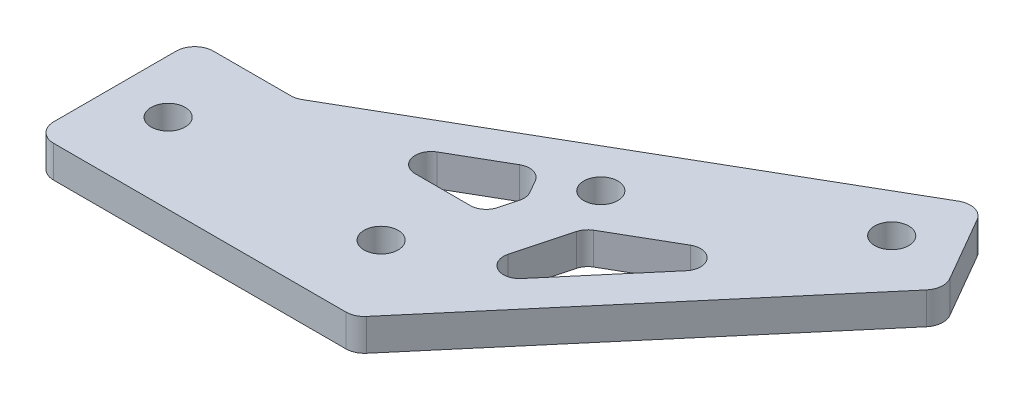
ISO-10303-21;
HEADER;
FILE_DESCRIPTION(('STEP AP214'),'2;1');
FILE_NAME('part.step','',(''),(''),'','','');
FILE_SCHEMA(('AUTOMOTIVE_DESIGN { 1 0 10303 214 1 1 1 1 }'));
ENDSEC;
DATA;
#1=APPLICATION_CONTEXT('core data for automotive mechanical design processes');
#2=APPLICATION_PROTOCOL_DEFINITION('international standard','automotive_design',2000,#1);
#3=PRODUCT_CONTEXT('',#1,'mechanical');
#4=PRODUCT('Part','Part','',(#3));
#5=PRODUCT_RELATED_PRODUCT_CATEGORY('part','',(#4));
#6=PRODUCT_DEFINITION_FORMATION('','',#4);
#7=PRODUCT_DEFINITION_CONTEXT('part definition',#1,'design');
#8=PRODUCT_DEFINITION('design','',#6,#7);
#9=PRODUCT_DEFINITION_SHAPE('','',#8);
#10=(LENGTH_UNIT() NAMED_UNIT(*) SI_UNIT(.MILLI.,.METRE.));
#11=(NAMED_UNIT(*) PLANE_ANGLE_UNIT() SI_UNIT($,.RADIAN.));
#12=(NAMED_UNIT(*) SI_UNIT($,.STERADIAN.) SOLID_ANGLE_UNIT());
#13=UNCERTAINTY_MEASURE_WITH_UNIT(LENGTH_MEASURE(1.E-05),#10,'distance_accuracy_value','');
#14=(GEOMETRIC_REPRESENTATION_CONTEXT(3) GLOBAL_UNCERTAINTY_ASSIGNED_CONTEXT((#13)) GLOBAL_UNIT_ASSIGNED_CONTEXT((#10,
#11,#12)) REPRESENTATION_CONTEXT('',''));
#15=CARTESIAN_POINT('',(0.,0.,0.));
#16=DIRECTION('',(0.,0.,1.));
#17=DIRECTION('',(1.,0.,0.));
#18=AXIS2_PLACEMENT_3D('',#15,#16,#17);
#19=CARTESIAN_POINT('',(0.,1.5,0.));
#20=DIRECTION('',(0.,-1.,0.));
#21=DIRECTION('',(0.,0.,-1.));
#22=AXIS2_PLACEMENT_3D('',#19,#20,#21);
#23=PLANE('',#22);
#24=DIRECTION('',(-0.258819045102521,0.,0.965925826289068));
#25=VECTOR('',#24,1.);
#26=CARTESIAN_POINT('',(30.6351432602032,1.5,8.20866189658321));
#27=LINE('',#26,#25);
#28=CARTESIAN_POINT('',(33.472623995892,1.5,-2.38096037450546));
#29=VERTEX_POINT('',#28);
#30=CARTESIAN_POINT('',(32.1164978136408,1.5,2.68017143913028));
#31=VERTEX_POINT('',#30);
#32=EDGE_CURVE('E306',#29,#31,#27,.T.);
#33=ORIENTED_EDGE('',*,*,#32,.F.);
#34=CARTESIAN_POINT('',(34.9215127353256,1.5,-1.99273180685168));
#35=DIRECTION('',(0.,-1.,0.));
#36=DIRECTION('',(0.,0.,-1.));
#37=AXIS2_PLACEMENT_3D('',#34,#35,#36);
#38=CIRCLE('',#37,1.5);
#39=CARTESIAN_POINT('',(34.1715127353256,1.5,-3.29176991252834));
#40=VERTEX_POINT('',#39);
#41=EDGE_CURVE('E285',#29,#40,#38,.T.);
#42=ORIENTED_EDGE('',*,*,#41,.T.);
#43=DIRECTION('',(0.866025403784438,0.,-0.500000000000001));
#44=VECTOR('',#43,1.);
#45=CARTESIAN_POINT('',(7.11750000000004,1.5,12.3278716228715));
#46=LINE('',#45,#44);
#47=CARTESIAN_POINT('',(39.9291176898745,1.5,-6.61592468292466));
#48=VERTEX_POINT('',#47);
#49=EDGE_CURVE('E309',#40,#48,#46,.T.);
#50=ORIENTED_EDGE('',*,*,#49,.T.);
#51=CARTESIAN_POINT('',(40.6791176898745,1.5,-5.31688657724799));
#52=DIRECTION('',(0.,-1.,0.));
#53=DIRECTION('',(0.,0.,-1.));
#54=AXIS2_PLACEMENT_3D('',#51,#52,#53);
#55=CIRCLE('',#54,1.5);
#56=CARTESIAN_POINT('',(41.8229525524503,1.5,-4.34650427776186));
#57=VERTEX_POINT('',#56);
#58=EDGE_CURVE('E284',#48,#57,#55,.T.);
#59=ORIENTED_EDGE('',*,*,#58,.T.);
#60=DIRECTION('',(0.646921532990766,0.,-0.762556575050584));
#61=VECTOR('',#60,1.);
#62=CARTESIAN_POINT('',(22.175541919768,1.5,18.8128147379565));
#63=LINE('',#62,#61);
#64=CARTESIAN_POINT('',(34.7092214156503,1.5,4.03878230627021));
#65=VERTEX_POINT('',#64);
#66=EDGE_CURVE('E290',#65,#57,#63,.T.);
#67=ORIENTED_EDGE('',*,*,#66,.F.);
#68=CARTESIAN_POINT('',(33.5653865530744,1.5,3.06840000678406));
#69=DIRECTION('',(0.,-1.,0.));
#70=DIRECTION('',(0.,0.,-1.));
#71=AXIS2_PLACEMENT_3D('',#68,#69,#70);
#72=CIRCLE('',#71,1.5);
#73=EDGE_CURVE('E225',#65,#31,#72,.T.);
#74=ORIENTED_EDGE('',*,*,#73,.T.);
#75=EDGE_LOOP('',(#33,#42,#50,#59,#67,#74));
#76=FACE_BOUND('',#75,.T.);
#77=DIRECTION('',(-1.,0.,0.));
#78=VECTOR('',#77,1.);
#79=CARTESIAN_POINT('',(0.,1.5,0.));
#80=LINE('',#79,#78);
#81=CARTESIAN_POINT('',(9.00108891324583,1.5,0.));
#82=VERTEX_POINT('',#81);
#83=CARTESIAN_POINT('',(1.75,1.5,0.));
#84=VERTEX_POINT('',#83);
#85=EDGE_CURVE('E460',#82,#84,#80,.T.);
#86=ORIENTED_EDGE('',*,*,#85,.T.);
#87=CARTESIAN_POINT('',(1.75,1.5,1.75));
#88=DIRECTION('',(0.,-1.,0.));
#89=DIRECTION('',(0.,0.,-1.));
#90=AXIS2_PLACEMENT_3D('',#87,#88,#89);
#91=CIRCLE('',#90,1.75);
#92=CARTESIAN_POINT('',(0.,1.5,1.75));
#93=VERTEX_POINT('',#92);
#94=EDGE_CURVE('E361',#84,#93,#91,.F.);
#95=ORIENTED_EDGE('',*,*,#94,.T.);
#96=DIRECTION('',(0.,0.,1.));
#97=VECTOR('',#96,1.);
#98=CARTESIAN_POINT('',(0.,1.5,15.));
#99=LINE('',#98,#97);
#100=CARTESIAN_POINT('',(0.,1.5,13.25));
#101=VERTEX_POINT('',#100);
#102=EDGE_CURVE('E456',#93,#101,#99,.T.);
#103=ORIENTED_EDGE('',*,*,#102,.T.);
#104=CARTESIAN_POINT('',(1.75,1.5,13.25));
#105=DIRECTION('',(0.,-1.,0.));
#106=DIRECTION('',(0.,0.,-1.));
#107=AXIS2_PLACEMENT_3D('',#104,#105,#106);
#108=CIRCLE('',#107,1.75);
#109=CARTESIAN_POINT('',(1.75000000000001,1.5,15.));
#110=VERTEX_POINT('',#109);
#111=EDGE_CURVE('E365',#101,#110,#108,.F.);
#112=ORIENTED_EDGE('',*,*,#111,.T.);
#113=DIRECTION('',(1.,0.,0.));
#114=VECTOR('',#113,1.);
#115=CARTESIAN_POINT('',(30.,1.5,15.));
#116=LINE('',#115,#114);
#117=CARTESIAN_POINT('',(29.1897160978185,1.5,15.));
#118=VERTEX_POINT('',#117);
#119=EDGE_CURVE('E452',#110,#118,#116,.T.);
#120=ORIENTED_EDGE('',*,*,#119,.T.);
#121=CARTESIAN_POINT('',(29.1897160978185,1.5,13.25));
#122=DIRECTION('',(0.,-1.,0.));
#123=DIRECTION('',(0.,0.,-1.));
#124=AXIS2_PLACEMENT_3D('',#121,#122,#123);
#125=CIRCLE('',#124,1.75);
#126=CARTESIAN_POINT('',(30.524190104157,1.5,14.3821126827338));
#127=VERTEX_POINT('',#126);
#128=EDGE_CURVE('E376',#118,#127,#125,.F.);
#129=ORIENTED_EDGE('',*,*,#128,.T.);
#130=DIRECTION('',(0.646921532990766,0.,-0.762556575050584));
#131=VECTOR('',#130,1.);
#132=CARTESIAN_POINT('',(55.4507621135331,1.5,-15.));
#133=LINE('',#132,#131);
#134=CARTESIAN_POINT('',(54.6534768491289,1.5,-14.0602026836986));
#135=VERTEX_POINT('',#134);
#136=EDGE_CURVE('E449',#127,#135,#133,.T.);
#137=ORIENTED_EDGE('',*,*,#136,.T.);
#138=CARTESIAN_POINT('',(53.3190028427904,1.5,-15.1923153664324));
#139=DIRECTION('',(0.,-1.,0.));
#140=DIRECTION('',(0.,0.,-1.));
#141=AXIS2_PLACEMENT_3D('',#138,#139,#140);
#142=CIRCLE('',#141,1.75);
#143=CARTESIAN_POINT('',(54.8345472994132,1.5,-16.0673153664324));
#144=VERTEX_POINT('',#143);
#145=EDGE_CURVE('E373',#135,#144,#142,.F.);
#146=ORIENTED_EDGE('',*,*,#145,.T.);
#147=DIRECTION('',(-0.500000000000002,0.,-0.866025403784437));
#148=VECTOR('',#147,1.);
#149=CARTESIAN_POINT('',(50.4507621135332,1.5,-23.6602540378443));
#150=LINE('',#149,#148);
#151=CARTESIAN_POINT('',(51.3257621135332,1.5,-22.1447095812216));
#152=VERTEX_POINT('',#151);
#153=EDGE_CURVE('E278',#144,#152,#150,.T.);
#154=ORIENTED_EDGE('',*,*,#153,.T.);
#155=CARTESIAN_POINT('',(49.8102176569104,1.5,-21.2697095812216));
#156=DIRECTION('',(0.,-1.,0.));
#157=DIRECTION('',(0.,0.,-1.));
#158=AXIS2_PLACEMENT_3D('',#155,#156,#157);
#159=CIRCLE('',#158,1.75);
#160=CARTESIAN_POINT('',(48.9352176569104,1.5,-22.7852540378443));
#161=VERTEX_POINT('',#160);
#162=EDGE_CURVE('E369',#152,#161,#159,.F.);
#163=ORIENTED_EDGE('',*,*,#162,.T.);
#164=DIRECTION('',(-0.866025403784437,0.,0.500000000000002));
#165=VECTOR('',#164,1.);
#166=CARTESIAN_POINT('',(24.47,1.5,-8.66025403784428));
#167=LINE('',#166,#165);
#168=CARTESIAN_POINT('',(9.87608891324584,1.5,-0.234455543377227));
#169=VERTEX_POINT('',#168);
#170=EDGE_CURVE('E425',#161,#169,#167,.T.);
#171=ORIENTED_EDGE('',*,*,#170,.T.);
#172=CARTESIAN_POINT('',(9.00108891324583,1.5,-1.75));
#173=DIRECTION('',(0.,-1.,0.));
#174=DIRECTION('',(0.,0.,-1.));
#175=AXIS2_PLACEMENT_3D('',#172,#173,#174);
#176=CIRCLE('',#175,1.75);
#177=EDGE_CURVE('E12',#169,#82,#176,.T.);
#178=ORIENTED_EDGE('',*,*,#177,.T.);
#179=EDGE_LOOP('',(#86,#95,#103,#112,#120,#129,#137,#146,#154,#163,#171,#178));
#180=FACE_BOUND('',#179,.T.);
#181=CARTESIAN_POINT('',(48.620635094611,1.5,-16.8301270189222));
#182=DIRECTION('',(0.,1.,0.));
#183=DIRECTION('',(0.,0.,1.));
#184=AXIS2_PLACEMENT_3D('',#181,#182,#183);
#185=CIRCLE('',#184,1.59999999999999);
#186=CARTESIAN_POINT('',(48.620635094611,1.5,-15.2301270189222));
#187=VERTEX_POINT('',#186);
#188=EDGE_CURVE('E446',#187,#187,#185,.T.);
#189=ORIENTED_EDGE('',*,*,#188,.F.);
#190=EDGE_LOOP('',(#189));
#191=FACE_BOUND('',#190,.T.);
#192=CARTESIAN_POINT('',(25.,1.5,7.5));
#193=DIRECTION('',(0.,1.,0.));
#194=DIRECTION('',(0.,0.,1.));
#195=AXIS2_PLACEMENT_3D('',#192,#193,#194);
#196=CIRCLE('',#195,1.6);
#197=CARTESIAN_POINT('',(25.,1.5,9.1));
#198=VERTEX_POINT('',#197);
#199=EDGE_CURVE('E471',#198,#198,#196,.T.);
#200=ORIENTED_EDGE('',*,*,#199,.F.);
#201=EDGE_LOOP('',(#200));
#202=FACE_BOUND('',#201,.T.);
#203=CARTESIAN_POINT('',(31.3001270189222,1.5,-6.83012701892215));
#204=DIRECTION('',(0.,1.,0.));
#205=DIRECTION('',(0.,0.,1.));
#206=AXIS2_PLACEMENT_3D('',#203,#204,#205);
#207=CIRCLE('',#206,1.60000000000001);
#208=CARTESIAN_POINT('',(31.3001270189222,1.5,-5.23012701892213));
#209=VERTEX_POINT('',#208);
#210=EDGE_CURVE('E478',#209,#209,#207,.T.);
#211=ORIENTED_EDGE('',*,*,#210,.F.);
#212=EDGE_LOOP('',(#211));
#213=FACE_BOUND('',#212,.T.);
#214=CARTESIAN_POINT('',(5.,1.5,7.5));
#215=DIRECTION('',(0.,1.,0.));
#216=DIRECTION('',(0.,0.,1.));
#217=AXIS2_PLACEMENT_3D('',#214,#215,#216);
#218=CIRCLE('',#217,1.6);
#219=CARTESIAN_POINT('',(5.,1.5,9.1));
#220=VERTEX_POINT('',#219);
#221=EDGE_CURVE('E256',#220,#220,#218,.T.);
#222=ORIENTED_EDGE('',*,*,#221,.F.);
#223=EDGE_LOOP('',(#222));
#224=FACE_BOUND('',#223,.T.);
#225=DIRECTION('',(0.500000000000001,0.,0.866025403784438));
#226=VECTOR('',#225,1.);
#227=CARTESIAN_POINT('',(22.5355127018922,1.5,-13.0108843247637));
#228=LINE('',#227,#226);
#229=CARTESIAN_POINT('',(27.4030127018923,1.5,-4.58012701892208));
#230=VERTEX_POINT('',#229);
#231=CARTESIAN_POINT('',(28.1049156630359,1.5,-3.36439542823822));
#232=VERTEX_POINT('',#231);
#233=EDGE_CURVE('E198',#230,#232,#228,.T.);
#234=ORIENTED_EDGE('',*,*,#233,.T.);
#235=CARTESIAN_POINT('',(26.8058775573593,1.5,-2.61439542823822));
#236=DIRECTION('',(0.,-1.,0.));
#237=DIRECTION('',(0.,0.,-1.));
#238=AXIS2_PLACEMENT_3D('',#235,#236,#237);
#239=CIRCLE('',#238,1.5);
#240=CARTESIAN_POINT('',(28.2547662967929,1.5,-2.22616686058444));
#241=VERTEX_POINT('',#240);
#242=EDGE_CURVE('E215',#232,#241,#239,.T.);
#243=ORIENTED_EDGE('',*,*,#242,.T.);
#244=DIRECTION('',(-0.258819045102522,0.,0.965925826289068));
#245=VECTOR('',#244,1.);
#246=CARTESIAN_POINT('',(25.8055141287578,1.5,6.91456667107061));
#247=LINE('',#246,#245);
#248=CARTESIAN_POINT('',(27.8221903455319,1.5,-0.611771432346216));
#249=VERTEX_POINT('',#248);
#250=EDGE_CURVE('E206',#241,#249,#247,.T.);
#251=ORIENTED_EDGE('',*,*,#250,.T.);
#252=CARTESIAN_POINT('',(26.3733016060983,1.5,-1.));
#253=DIRECTION('',(0.,-1.,0.));
#254=DIRECTION('',(0.,0.,-1.));
#255=AXIS2_PLACEMENT_3D('',#252,#253,#254);
#256=CIRCLE('',#255,1.5);
#257=CARTESIAN_POINT('',(26.3733016060983,1.5,0.5));
#258=VERTEX_POINT('',#257);
#259=EDGE_CURVE('E158',#249,#258,#256,.T.);
#260=ORIENTED_EDGE('',*,*,#259,.T.);
#261=DIRECTION('',(1.,0.,0.));
#262=VECTOR('',#261,1.);
#263=CARTESIAN_POINT('',(0.,1.5,0.5));
#264=LINE('',#263,#262);
#265=CARTESIAN_POINT('',(21.2020508075691,1.5,0.5));
#266=VERTEX_POINT('',#265);
#267=EDGE_CURVE('E52',#266,#258,#264,.T.);
#268=ORIENTED_EDGE('',*,*,#267,.F.);
#269=CARTESIAN_POINT('',(21.2020508075691,1.5,-1.));
#270=DIRECTION('',(0.,-1.,0.));
#271=DIRECTION('',(0.,0.,-1.));
#272=AXIS2_PLACEMENT_3D('',#269,#270,#271);
#273=CIRCLE('',#272,1.5);
#274=CARTESIAN_POINT('',(20.4520508075692,1.5,-2.29903810567666));
#275=VERTEX_POINT('',#274);
#276=EDGE_CURVE('E164',#266,#275,#273,.T.);
#277=ORIENTED_EDGE('',*,*,#276,.T.);
#278=DIRECTION('',(-0.866025403784438,0.,0.500000000000002));
#279=VECTOR('',#278,1.);
#280=CARTESIAN_POINT('',(4.1175000000001,1.5,7.13171920016499));
#281=LINE('',#280,#279);
#282=CARTESIAN_POINT('',(25.3539745962156,1.5,-5.12916512459875));
#283=VERTEX_POINT('',#282);
#284=EDGE_CURVE('E189',#283,#275,#281,.T.);
#285=ORIENTED_EDGE('',*,*,#284,.F.);
#286=CARTESIAN_POINT('',(26.1039745962156,1.5,-3.83012701892209));
#287=DIRECTION('',(0.,-1.,0.));
#288=DIRECTION('',(0.,0.,-1.));
#289=AXIS2_PLACEMENT_3D('',#286,#287,#288);
#290=CIRCLE('',#289,1.5);
#291=EDGE_CURVE('E210',#283,#230,#290,.T.);
#292=ORIENTED_EDGE('',*,*,#291,.T.);
#293=EDGE_LOOP('',(#234,#243,#251,#260,#268,#277,#285,#292));
#294=FACE_BOUND('',#293,.T.);
#295=ADVANCED_FACE('F48',(#76,#180,#191,#202,#213,#224,#294),#23,.F.);
#296=CARTESIAN_POINT('',(0.,-1.5,0.));
#297=DIRECTION('',(0.,-1.,0.));
#298=DIRECTION('',(0.,0.,-1.));
#299=AXIS2_PLACEMENT_3D('',#296,#297,#298);
#300=PLANE('',#299);
#301=CARTESIAN_POINT('',(31.3001270189222,-1.5,-6.83012701892215));
#302=DIRECTION('',(0.,1.,0.));
#303=DIRECTION('',(0.,0.,1.));
#304=AXIS2_PLACEMENT_3D('',#301,#302,#303);
#305=CIRCLE('',#304,1.60000000000001);
#306=CARTESIAN_POINT('',(31.3001270189222,-1.5,-5.23012701892213));
#307=VERTEX_POINT('',#306);
#308=EDGE_CURVE('E482',#307,#307,#305,.T.);
#309=ORIENTED_EDGE('',*,*,#308,.T.);
#310=EDGE_LOOP('',(#309));
#311=FACE_BOUND('',#310,.T.);
#312=CARTESIAN_POINT('',(48.620635094611,-1.5,-16.8301270189222));
#313=DIRECTION('',(0.,1.,0.));
#314=DIRECTION('',(0.,0.,1.));
#315=AXIS2_PLACEMENT_3D('',#312,#313,#314);
#316=CIRCLE('',#315,1.59999999999999);
#317=CARTESIAN_POINT('',(48.620635094611,-1.5,-15.2301270189222));
#318=VERTEX_POINT('',#317);
#319=EDGE_CURVE('E467',#318,#318,#316,.T.);
#320=ORIENTED_EDGE('',*,*,#319,.T.);
#321=EDGE_LOOP('',(#320));
#322=FACE_BOUND('',#321,.T.);
#323=DIRECTION('',(0.,0.,1.));
#324=VECTOR('',#323,1.);
#325=CARTESIAN_POINT('',(0.,-1.5,15.));
#326=LINE('',#325,#324);
#327=CARTESIAN_POINT('',(0.,-1.5,1.75));
#328=VERTEX_POINT('',#327);
#329=CARTESIAN_POINT('',(0.,-1.5,13.25));
#330=VERTEX_POINT('',#329);
#331=EDGE_CURVE('E434',#328,#330,#326,.T.);
#332=ORIENTED_EDGE('',*,*,#331,.F.);
#333=CARTESIAN_POINT('',(1.75,-1.5,1.75));
#334=DIRECTION('',(0.,-1.,0.));
#335=DIRECTION('',(0.,0.,-1.));
#336=AXIS2_PLACEMENT_3D('',#333,#334,#335);
#337=CIRCLE('',#336,1.75);
#338=CARTESIAN_POINT('',(1.75,-1.5,0.));
#339=VERTEX_POINT('',#338);
#340=EDGE_CURVE('E380',#328,#339,#337,.T.);
#341=ORIENTED_EDGE('',*,*,#340,.T.);
#342=DIRECTION('',(-1.,0.,0.));
#343=VECTOR('',#342,1.);
#344=CARTESIAN_POINT('',(0.,-1.5,0.));
#345=LINE('',#344,#343);
#346=CARTESIAN_POINT('',(9.00108891324583,-1.5,0.));
#347=VERTEX_POINT('',#346);
#348=EDGE_CURVE('E438',#347,#339,#345,.T.);
#349=ORIENTED_EDGE('',*,*,#348,.F.);
#350=CARTESIAN_POINT('',(9.00108891324583,-1.5,-1.75));
#351=DIRECTION('',(0.,-1.,0.));
#352=DIRECTION('',(0.,0.,-1.));
#353=AXIS2_PLACEMENT_3D('',#350,#351,#352);
#354=CIRCLE('',#353,1.75);
#355=CARTESIAN_POINT('',(9.87608891324584,-1.5,-0.234455543377237));
#356=VERTEX_POINT('',#355);
#357=EDGE_CURVE('E59',#347,#356,#354,.F.);
#358=ORIENTED_EDGE('',*,*,#357,.T.);
#359=DIRECTION('',(-0.866025403784438,0.,0.500000000000001));
#360=VECTOR('',#359,1.);
#361=CARTESIAN_POINT('',(24.47,-1.5,-8.66025403784428));
#362=LINE('',#361,#360);
#363=CARTESIAN_POINT('',(48.9352176569104,-1.5,-22.7852540378443));
#364=VERTEX_POINT('',#363);
#365=EDGE_CURVE('E442',#364,#356,#362,.T.);
#366=ORIENTED_EDGE('',*,*,#365,.F.);
#367=CARTESIAN_POINT('',(49.8102176569104,-1.5,-21.2697095812216));
#368=DIRECTION('',(0.,-1.,0.));
#369=DIRECTION('',(0.,0.,-1.));
#370=AXIS2_PLACEMENT_3D('',#367,#368,#369);
#371=CIRCLE('',#370,1.75);
#372=CARTESIAN_POINT('',(51.3257621135332,-1.5,-22.1447095812216));
#373=VERTEX_POINT('',#372);
#374=EDGE_CURVE('E387',#364,#373,#371,.T.);
#375=ORIENTED_EDGE('',*,*,#374,.T.);
#376=DIRECTION('',(-0.500000000000002,0.,-0.866025403784437));
#377=VECTOR('',#376,1.);
#378=CARTESIAN_POINT('',(50.4507621135332,-1.5,-23.6602540378443));
#379=LINE('',#378,#377);
#380=CARTESIAN_POINT('',(54.8345472994132,-1.5,-16.0673153664324));
#381=VERTEX_POINT('',#380);
#382=EDGE_CURVE('E422',#381,#373,#379,.T.);
#383=ORIENTED_EDGE('',*,*,#382,.F.);
#384=CARTESIAN_POINT('',(53.3190028427904,-1.5,-15.1923153664324));
#385=DIRECTION('',(0.,-1.,0.));
#386=DIRECTION('',(0.,0.,-1.));
#387=AXIS2_PLACEMENT_3D('',#384,#385,#386);
#388=CIRCLE('',#387,1.75);
#389=CARTESIAN_POINT('',(54.6534768491289,-1.5,-14.0602026836986));
#390=VERTEX_POINT('',#389);
#391=EDGE_CURVE('E391',#381,#390,#388,.T.);
#392=ORIENTED_EDGE('',*,*,#391,.T.);
#393=DIRECTION('',(0.646921532990766,0.,-0.762556575050584));
#394=VECTOR('',#393,1.);
#395=CARTESIAN_POINT('',(55.4507621135331,-1.5,-15.));
#396=LINE('',#395,#394);
#397=CARTESIAN_POINT('',(30.524190104157,-1.5,14.3821126827338));
#398=VERTEX_POINT('',#397);
#399=EDGE_CURVE('E426',#398,#390,#396,.T.);
#400=ORIENTED_EDGE('',*,*,#399,.F.);
#401=CARTESIAN_POINT('',(29.1897160978185,-1.5,13.25));
#402=DIRECTION('',(0.,-1.,0.));
#403=DIRECTION('',(0.,0.,-1.));
#404=AXIS2_PLACEMENT_3D('',#401,#402,#403);
#405=CIRCLE('',#404,1.75);
#406=CARTESIAN_POINT('',(29.1897160978185,-1.5,15.));
#407=VERTEX_POINT('',#406);
#408=EDGE_CURVE('E395',#398,#407,#405,.T.);
#409=ORIENTED_EDGE('',*,*,#408,.T.);
#410=DIRECTION('',(1.,0.,0.));
#411=VECTOR('',#410,1.);
#412=CARTESIAN_POINT('',(30.,-1.5,15.));
#413=LINE('',#412,#411);
#414=CARTESIAN_POINT('',(1.75000000000001,-1.5,15.));
#415=VERTEX_POINT('',#414);
#416=EDGE_CURVE('E430',#415,#407,#413,.T.);
#417=ORIENTED_EDGE('',*,*,#416,.F.);
#418=CARTESIAN_POINT('',(1.75,-1.5,13.25));
#419=DIRECTION('',(0.,-1.,0.));
#420=DIRECTION('',(0.,0.,-1.));
#421=AXIS2_PLACEMENT_3D('',#418,#419,#420);
#422=CIRCLE('',#421,1.75);
#423=EDGE_CURVE('E383',#415,#330,#422,.T.);
#424=ORIENTED_EDGE('',*,*,#423,.T.);
#425=EDGE_LOOP('',(#332,#341,#349,#358,#366,#375,#383,#392,#400,#409,#417,#424));
#426=FACE_BOUND('',#425,.T.);
#427=CARTESIAN_POINT('',(25.,-1.5,7.5));
#428=DIRECTION('',(0.,1.,0.));
#429=DIRECTION('',(0.,0.,1.));
#430=AXIS2_PLACEMENT_3D('',#427,#428,#429);
#431=CIRCLE('',#430,1.6);
#432=CARTESIAN_POINT('',(25.,-1.5,9.1));
#433=VERTEX_POINT('',#432);
#434=EDGE_CURVE('E475',#433,#433,#431,.T.);
#435=ORIENTED_EDGE('',*,*,#434,.T.);
#436=EDGE_LOOP('',(#435));
#437=FACE_BOUND('',#436,.T.);
#438=CARTESIAN_POINT('',(5.,-1.5,7.5));
#439=DIRECTION('',(0.,1.,0.));
#440=DIRECTION('',(0.,0.,1.));
#441=AXIS2_PLACEMENT_3D('',#438,#439,#440);
#442=CIRCLE('',#441,1.6);
#443=CARTESIAN_POINT('',(5.,-1.5,9.1));
#444=VERTEX_POINT('',#443);
#445=EDGE_CURVE('E248',#444,#444,#442,.T.);
#446=ORIENTED_EDGE('',*,*,#445,.T.);
#447=EDGE_LOOP('',(#446));
#448=FACE_BOUND('',#447,.T.);
#449=DIRECTION('',(-0.258819045102521,0.,0.965925826289068));
#450=VECTOR('',#449,1.);
#451=CARTESIAN_POINT('',(30.6351432602032,-1.5,8.20866189658321));
#452=LINE('',#451,#450);
#453=CARTESIAN_POINT('',(33.472623995892,-1.5,-2.38096037450546));
#454=VERTEX_POINT('',#453);
#455=CARTESIAN_POINT('',(32.1164978136408,-1.5,2.68017143913028));
#456=VERTEX_POINT('',#455);
#457=EDGE_CURVE('E289',#454,#456,#452,.T.);
#458=ORIENTED_EDGE('',*,*,#457,.T.);
#459=CARTESIAN_POINT('',(33.5653865530744,-1.5,3.06840000678406));
#460=DIRECTION('',(0.,-1.,0.));
#461=DIRECTION('',(0.,0.,-1.));
#462=AXIS2_PLACEMENT_3D('',#459,#460,#461);
#463=CIRCLE('',#462,1.5);
#464=CARTESIAN_POINT('',(34.7092214156503,-1.5,4.03878230627021));
#465=VERTEX_POINT('',#464);
#466=EDGE_CURVE('E296',#456,#465,#463,.F.);
#467=ORIENTED_EDGE('',*,*,#466,.T.);
#468=DIRECTION('',(0.646921532990766,0.,-0.762556575050584));
#469=VECTOR('',#468,1.);
#470=CARTESIAN_POINT('',(22.175541919768,-1.5,18.8128147379565));
#471=LINE('',#470,#469);
#472=CARTESIAN_POINT('',(41.8229525524503,-1.5,-4.34650427776186));
#473=VERTEX_POINT('',#472);
#474=EDGE_CURVE('E220',#465,#473,#471,.T.);
#475=ORIENTED_EDGE('',*,*,#474,.T.);
#476=CARTESIAN_POINT('',(40.6791176898745,-1.5,-5.31688657724799));
#477=DIRECTION('',(0.,-1.,0.));
#478=DIRECTION('',(0.,0.,-1.));
#479=AXIS2_PLACEMENT_3D('',#476,#477,#478);
#480=CIRCLE('',#479,1.5);
#481=CARTESIAN_POINT('',(39.9291176898745,-1.5,-6.61592468292466));
#482=VERTEX_POINT('',#481);
#483=EDGE_CURVE('E213',#473,#482,#480,.F.);
#484=ORIENTED_EDGE('',*,*,#483,.T.);
#485=DIRECTION('',(0.866025403784438,0.,-0.500000000000001));
#486=VECTOR('',#485,1.);
#487=CARTESIAN_POINT('',(7.11750000000004,-1.5,12.3278716228715));
#488=LINE('',#487,#486);
#489=CARTESIAN_POINT('',(34.1715127353256,-1.5,-3.29176991252834));
#490=VERTEX_POINT('',#489);
#491=EDGE_CURVE('E286',#490,#482,#488,.T.);
#492=ORIENTED_EDGE('',*,*,#491,.F.);
#493=CARTESIAN_POINT('',(34.9215127353256,-1.5,-1.99273180685168));
#494=DIRECTION('',(0.,-1.,0.));
#495=DIRECTION('',(0.,0.,-1.));
#496=AXIS2_PLACEMENT_3D('',#493,#494,#495);
#497=CIRCLE('',#496,1.5);
#498=EDGE_CURVE('E281',#490,#454,#497,.F.);
#499=ORIENTED_EDGE('',*,*,#498,.T.);
#500=EDGE_LOOP('',(#458,#467,#475,#484,#492,#499));
#501=FACE_BOUND('',#500,.T.);
#502=DIRECTION('',(-0.866025403784438,0.,0.500000000000002));
#503=VECTOR('',#502,1.);
#504=CARTESIAN_POINT('',(4.1175000000001,-1.5,7.13171920016499));
#505=LINE('',#504,#503);
#506=CARTESIAN_POINT('',(25.3539745962156,-1.5,-5.12916512459875));
#507=VERTEX_POINT('',#506);
#508=CARTESIAN_POINT('',(20.4520508075692,-1.5,-2.29903810567666));
#509=VERTEX_POINT('',#508);
#510=EDGE_CURVE('E240',#507,#509,#505,.T.);
#511=ORIENTED_EDGE('',*,*,#510,.T.);
#512=CARTESIAN_POINT('',(21.2020508075691,-1.5,-1.));
#513=DIRECTION('',(0.,-1.,0.));
#514=DIRECTION('',(0.,0.,-1.));
#515=AXIS2_PLACEMENT_3D('',#512,#513,#514);
#516=CIRCLE('',#515,1.5);
#517=CARTESIAN_POINT('',(21.2020508075691,-1.5,0.5));
#518=VERTEX_POINT('',#517);
#519=EDGE_CURVE('E173',#509,#518,#516,.F.);
#520=ORIENTED_EDGE('',*,*,#519,.T.);
#521=DIRECTION('',(1.,0.,0.));
#522=VECTOR('',#521,1.);
#523=CARTESIAN_POINT('',(0.,-1.5,0.5));
#524=LINE('',#523,#522);
#525=CARTESIAN_POINT('',(26.3733016060983,-1.5,0.5));
#526=VERTEX_POINT('',#525);
#527=EDGE_CURVE('E181',#518,#526,#524,.T.);
#528=ORIENTED_EDGE('',*,*,#527,.T.);
#529=CARTESIAN_POINT('',(26.3733016060983,-1.5,-1.));
#530=DIRECTION('',(0.,-1.,0.));
#531=DIRECTION('',(0.,0.,-1.));
#532=AXIS2_PLACEMENT_3D('',#529,#530,#531);
#533=CIRCLE('',#532,1.5);
#534=CARTESIAN_POINT('',(27.822190345532,-1.5,-0.611771432346216));
#535=VERTEX_POINT('',#534);
#536=EDGE_CURVE('E221',#526,#535,#533,.F.);
#537=ORIENTED_EDGE('',*,*,#536,.T.);
#538=DIRECTION('',(-0.258819045102522,0.,0.965925826289068));
#539=VECTOR('',#538,1.);
#540=CARTESIAN_POINT('',(25.8055141287578,-1.5,6.91456667107061));
#541=LINE('',#540,#539);
#542=CARTESIAN_POINT('',(28.2547662967929,-1.5,-2.22616686058444));
#543=VERTEX_POINT('',#542);
#544=EDGE_CURVE('E188',#543,#535,#541,.T.);
#545=ORIENTED_EDGE('',*,*,#544,.F.);
#546=CARTESIAN_POINT('',(26.8058775573593,-1.5,-2.61439542823822));
#547=DIRECTION('',(0.,-1.,0.));
#548=DIRECTION('',(0.,0.,-1.));
#549=AXIS2_PLACEMENT_3D('',#546,#547,#548);
#550=CIRCLE('',#549,1.5);
#551=CARTESIAN_POINT('',(28.1049156630359,-1.5,-3.36439542823822));
#552=VERTEX_POINT('',#551);
#553=EDGE_CURVE('E218',#543,#552,#550,.F.);
#554=ORIENTED_EDGE('',*,*,#553,.T.);
#555=DIRECTION('',(0.500000000000001,0.,0.866025403784438));
#556=VECTOR('',#555,1.);
#557=CARTESIAN_POINT('',(22.5355127018922,-1.5,-13.0108843247637));
#558=LINE('',#557,#556);
#559=CARTESIAN_POINT('',(27.4030127018923,-1.5,-4.58012701892208));
#560=VERTEX_POINT('',#559);
#561=EDGE_CURVE('E195',#560,#552,#558,.T.);
#562=ORIENTED_EDGE('',*,*,#561,.F.);
#563=CARTESIAN_POINT('',(26.1039745962156,-1.5,-3.83012701892209));
#564=DIRECTION('',(0.,-1.,0.));
#565=DIRECTION('',(0.,0.,-1.));
#566=AXIS2_PLACEMENT_3D('',#563,#564,#565);
#567=CIRCLE('',#566,1.5);
#568=EDGE_CURVE('E212',#560,#507,#567,.F.);
#569=ORIENTED_EDGE('',*,*,#568,.T.);
#570=EDGE_LOOP('',(#511,#520,#528,#537,#545,#554,#562,#569));
#571=FACE_BOUND('',#570,.T.);
#572=ADVANCED_FACE('F498',(#311,#322,#426,#437,#448,#501,#571),#300,.T.);
#573=CARTESIAN_POINT('',(24.47,1.5,-8.66025403784428));
#574=DIRECTION('',(0.500000000000002,0.,0.866025403784438));
#575=DIRECTION('',(0.866025403784438,0.,-0.500000000000002));
#576=AXIS2_PLACEMENT_3D('',#573,#574,#575);
#577=PLANE('',#576);
#578=ORIENTED_EDGE('',*,*,#365,.T.);
#579=DIRECTION('',(0.,-1.,0.));
#580=VECTOR('',#579,1.);
#581=CARTESIAN_POINT('',(9.87608891324584,1.5,-0.234455543377234));
#582=LINE('',#581,#580);
#583=EDGE_CURVE('E407',#356,#169,#582,.F.);
#584=ORIENTED_EDGE('',*,*,#583,.T.);
#585=ORIENTED_EDGE('',*,*,#170,.F.);
#586=DIRECTION('',(0.,-1.,0.));
#587=VECTOR('',#586,1.);
#588=CARTESIAN_POINT('',(48.9352176569104,1.5,-22.7852540378443));
#589=LINE('',#588,#587);
#590=EDGE_CURVE('E411',#161,#364,#589,.T.);
#591=ORIENTED_EDGE('',*,*,#590,.T.);
#592=EDGE_LOOP('',(#578,#584,#585,#591));
#593=FACE_BOUND('',#592,.T.);
#594=ADVANCED_FACE('F503',(#593),#577,.F.);
#595=CARTESIAN_POINT('',(0.,1.5,0.));
#596=DIRECTION('',(0.,0.,1.));
#597=DIRECTION('',(1.,0.,0.));
#598=AXIS2_PLACEMENT_3D('',#595,#596,#597);
#599=PLANE('',#598);
#600=ORIENTED_EDGE('',*,*,#85,.F.);
#601=DIRECTION('',(0.,-1.,0.));
#602=VECTOR('',#601,1.);
#603=CARTESIAN_POINT('',(9.00108891324583,-1.5,0.));
#604=LINE('',#603,#602);
#605=EDGE_CURVE('E415',#82,#347,#604,.T.);
#606=ORIENTED_EDGE('',*,*,#605,.T.);
#607=ORIENTED_EDGE('',*,*,#348,.T.);
#608=DIRECTION('',(0.,-1.,0.));
#609=VECTOR('',#608,1.);
#610=CARTESIAN_POINT('',(1.75,1.5,0.));
#611=LINE('',#610,#609);
#612=EDGE_CURVE('E242',#339,#84,#611,.F.);
#613=ORIENTED_EDGE('',*,*,#612,.T.);
#614=EDGE_LOOP('',(#600,#606,#607,#613));
#615=FACE_BOUND('',#614,.T.);
#616=ADVANCED_FACE('F526',(#615),#599,.F.);
#617=CARTESIAN_POINT('',(0.,1.5,15.));
#618=DIRECTION('',(1.,0.,0.));
#619=DIRECTION('',(0.,0.,-1.));
#620=AXIS2_PLACEMENT_3D('',#617,#618,#619);
#621=PLANE('',#620);
#622=ORIENTED_EDGE('',*,*,#102,.F.);
#623=DIRECTION('',(0.,-1.,0.));
#624=VECTOR('',#623,1.);
#625=CARTESIAN_POINT('',(0.,1.5,1.75));
#626=LINE('',#625,#624);
#627=EDGE_CURVE('E399',#93,#328,#626,.T.);
#628=ORIENTED_EDGE('',*,*,#627,.T.);
#629=ORIENTED_EDGE('',*,*,#331,.T.);
#630=DIRECTION('',(0.,-1.,0.));
#631=VECTOR('',#630,1.);
#632=CARTESIAN_POINT('',(0.,1.5,13.25));
#633=LINE('',#632,#631);
#634=EDGE_CURVE('E403',#330,#101,#633,.F.);
#635=ORIENTED_EDGE('',*,*,#634,.T.);
#636=EDGE_LOOP('',(#622,#628,#629,#635));
#637=FACE_BOUND('',#636,.T.);
#638=ADVANCED_FACE('F522',(#637),#621,.F.);
#639=CARTESIAN_POINT('',(30.,1.5,15.));
#640=DIRECTION('',(0.,0.,-1.));
#641=DIRECTION('',(-1.,0.,0.));
#642=AXIS2_PLACEMENT_3D('',#639,#640,#641);
#643=PLANE('',#642);
#644=ORIENTED_EDGE('',*,*,#119,.F.);
#645=DIRECTION('',(0.,-1.,0.));
#646=VECTOR('',#645,1.);
#647=CARTESIAN_POINT('',(1.75,1.5,15.));
#648=LINE('',#647,#646);
#649=EDGE_CURVE('E353',#110,#415,#648,.T.);
#650=ORIENTED_EDGE('',*,*,#649,.T.);
#651=ORIENTED_EDGE('',*,*,#416,.T.);
#652=DIRECTION('',(0.,-1.,0.));
#653=VECTOR('',#652,1.);
#654=CARTESIAN_POINT('',(29.1897160978185,1.5,15.));
#655=LINE('',#654,#653);
#656=EDGE_CURVE('E357',#407,#118,#655,.F.);
#657=ORIENTED_EDGE('',*,*,#656,.T.);
#658=EDGE_LOOP('',(#644,#650,#651,#657));
#659=FACE_BOUND('',#658,.T.);
#660=ADVANCED_FACE('F518',(#659),#643,.F.);
#661=CARTESIAN_POINT('',(55.4507621135331,1.5,-15.));
#662=DIRECTION('',(-0.762556575050584,0.,-0.646921532990766));
#663=DIRECTION('',(-0.646921532990766,0.,0.762556575050584));
#664=AXIS2_PLACEMENT_3D('',#661,#662,#663);
#665=PLANE('',#664);
#666=ORIENTED_EDGE('',*,*,#399,.T.);
#667=DIRECTION('',(0.,-1.,0.));
#668=VECTOR('',#667,1.);
#669=CARTESIAN_POINT('',(54.6534768491289,1.5,-14.0602026836986));
#670=LINE('',#669,#668);
#671=EDGE_CURVE('E340',#390,#135,#670,.F.);
#672=ORIENTED_EDGE('',*,*,#671,.T.);
#673=ORIENTED_EDGE('',*,*,#136,.F.);
#674=DIRECTION('',(0.,-1.,0.));
#675=VECTOR('',#674,1.);
#676=CARTESIAN_POINT('',(30.524190104157,1.5,14.3821126827338));
#677=LINE('',#676,#675);
#678=EDGE_CURVE('E344',#127,#398,#677,.T.);
#679=ORIENTED_EDGE('',*,*,#678,.T.);
#680=EDGE_LOOP('',(#666,#672,#673,#679));
#681=FACE_BOUND('',#680,.T.);
#682=ADVANCED_FACE('F515',(#681),#665,.F.);
#683=CARTESIAN_POINT('',(50.4507621135332,1.5,-23.6602540378443));
#684=DIRECTION('',(-0.866025403784437,0.,0.500000000000002));
#685=DIRECTION('',(0.500000000000002,0.,0.866025403784437));
#686=AXIS2_PLACEMENT_3D('',#683,#684,#685);
#687=PLANE('',#686);
#688=ORIENTED_EDGE('',*,*,#382,.T.);
#689=DIRECTION('',(0.,-1.,0.));
#690=VECTOR('',#689,1.);
#691=CARTESIAN_POINT('',(51.3257621135332,1.5,-22.1447095812216));
#692=LINE('',#691,#690);
#693=EDGE_CURVE('E68',#373,#152,#692,.F.);
#694=ORIENTED_EDGE('',*,*,#693,.T.);
#695=ORIENTED_EDGE('',*,*,#153,.F.);
#696=DIRECTION('',(0.,-1.,0.));
#697=VECTOR('',#696,1.);
#698=CARTESIAN_POINT('',(54.8345472994132,1.5,-16.0673153664324));
#699=LINE('',#698,#697);
#700=EDGE_CURVE('E349',#144,#381,#699,.T.);
#701=ORIENTED_EDGE('',*,*,#700,.T.);
#702=EDGE_LOOP('',(#688,#694,#695,#701));
#703=FACE_BOUND('',#702,.T.);
#704=ADVANCED_FACE('F512',(#703),#687,.F.);
#705=CARTESIAN_POINT('',(48.620635094611,1.5,-16.8301270189222));
#706=DIRECTION('',(0.,-1.,0.));
#707=DIRECTION('',(0.,0.,-1.));
#708=AXIS2_PLACEMENT_3D('',#705,#706,#707);
#709=CYLINDRICAL_SURFACE('',#708,1.59999999999999);
#710=ORIENTED_EDGE('',*,*,#188,.T.);
#711=EDGE_LOOP('',(#710));
#712=FACE_BOUND('',#711,.T.);
#713=ORIENTED_EDGE('',*,*,#319,.F.);
#714=EDGE_LOOP('',(#713));
#715=FACE_BOUND('',#714,.T.);
#716=ADVANCED_FACE('F509',(#712,#715),#709,.F.);
#717=CARTESIAN_POINT('',(25.,1.5,7.5));
#718=DIRECTION('',(0.,-1.,0.));
#719=DIRECTION('',(0.,0.,-1.));
#720=AXIS2_PLACEMENT_3D('',#717,#718,#719);
#721=CYLINDRICAL_SURFACE('',#720,1.6);
#722=ORIENTED_EDGE('',*,*,#199,.T.);
#723=EDGE_LOOP('',(#722));
#724=FACE_BOUND('',#723,.T.);
#725=ORIENTED_EDGE('',*,*,#434,.F.);
#726=EDGE_LOOP('',(#725));
#727=FACE_BOUND('',#726,.T.);
#728=ADVANCED_FACE('F736',(#724,#727),#721,.F.);
#729=CARTESIAN_POINT('',(31.3001270189222,1.5,-6.83012701892215));
#730=DIRECTION('',(0.,-1.,0.));
#731=DIRECTION('',(0.,0.,-1.));
#732=AXIS2_PLACEMENT_3D('',#729,#730,#731);
#733=CYLINDRICAL_SURFACE('',#732,1.60000000000001);
#734=ORIENTED_EDGE('',*,*,#210,.T.);
#735=EDGE_LOOP('',(#734));
#736=FACE_BOUND('',#735,.T.);
#737=ORIENTED_EDGE('',*,*,#308,.F.);
#738=EDGE_LOOP('',(#737));
#739=FACE_BOUND('',#738,.T.);
#740=ADVANCED_FACE('F730',(#736,#739),#733,.F.);
#741=CARTESIAN_POINT('',(5.,1.5,7.5));
#742=DIRECTION('',(0.,-1.,0.));
#743=DIRECTION('',(0.,0.,-1.));
#744=AXIS2_PLACEMENT_3D('',#741,#742,#743);
#745=CYLINDRICAL_SURFACE('',#744,1.6);
#746=ORIENTED_EDGE('',*,*,#221,.T.);
#747=EDGE_LOOP('',(#746));
#748=FACE_BOUND('',#747,.T.);
#749=ORIENTED_EDGE('',*,*,#445,.F.);
#750=EDGE_LOOP('',(#749));
#751=FACE_BOUND('',#750,.T.);
#752=ADVANCED_FACE('F494',(#748,#751),#745,.F.);
#753=CARTESIAN_POINT('',(7.11750000000004,-1.5,12.3278716228715));
#754=DIRECTION('',(0.500000000000001,0.,0.866025403784438));
#755=DIRECTION('',(0.866025403784438,0.,-0.500000000000001));
#756=AXIS2_PLACEMENT_3D('',#753,#754,#755);
#757=PLANE('',#756);
#758=ORIENTED_EDGE('',*,*,#49,.F.);
#759=DIRECTION('',(0.,1.,0.));
#760=VECTOR('',#759,1.);
#761=CARTESIAN_POINT('',(34.1715127353256,-1.5,-3.29176991252834));
#762=LINE('',#761,#760);
#763=EDGE_CURVE('E174',#40,#490,#762,.F.);
#764=ORIENTED_EDGE('',*,*,#763,.T.);
#765=ORIENTED_EDGE('',*,*,#491,.T.);
#766=DIRECTION('',(0.,1.,0.));
#767=VECTOR('',#766,1.);
#768=CARTESIAN_POINT('',(39.9291176898745,-1.5,-6.61592468292466));
#769=LINE('',#768,#767);
#770=EDGE_CURVE('E320',#482,#48,#769,.T.);
#771=ORIENTED_EDGE('',*,*,#770,.T.);
#772=EDGE_LOOP('',(#758,#764,#765,#771));
#773=FACE_BOUND('',#772,.T.);
#774=ADVANCED_FACE('F573',(#773),#757,.T.);
#775=CARTESIAN_POINT('',(22.175541919768,-1.5,18.8128147379565));
#776=DIRECTION('',(0.762556575050584,0.,0.646921532990766));
#777=DIRECTION('',(0.646921532990766,0.,-0.762556575050584));
#778=AXIS2_PLACEMENT_3D('',#775,#776,#777);
#779=PLANE('',#778);
#780=ORIENTED_EDGE('',*,*,#474,.F.);
#781=DIRECTION('',(0.,1.,0.));
#782=VECTOR('',#781,1.);
#783=CARTESIAN_POINT('',(34.7092214156503,-1.5,4.03878230627021));
#784=LINE('',#783,#782);
#785=EDGE_CURVE('E327',#465,#65,#784,.T.);
#786=ORIENTED_EDGE('',*,*,#785,.T.);
#787=ORIENTED_EDGE('',*,*,#66,.T.);
#788=DIRECTION('',(0.,1.,0.));
#789=VECTOR('',#788,1.);
#790=CARTESIAN_POINT('',(41.8229525524503,-1.5,-4.34650427776186));
#791=LINE('',#790,#789);
#792=EDGE_CURVE('E273',#57,#473,#791,.F.);
#793=ORIENTED_EDGE('',*,*,#792,.T.);
#794=EDGE_LOOP('',(#780,#786,#787,#793));
#795=FACE_BOUND('',#794,.T.);
#796=ADVANCED_FACE('F563',(#795),#779,.F.);
#797=CARTESIAN_POINT('',(30.6351432602032,-1.5,8.20866189658321));
#798=DIRECTION('',(-0.965925826289068,0.,-0.258819045102521));
#799=DIRECTION('',(-0.258819045102521,0.,0.965925826289068));
#800=AXIS2_PLACEMENT_3D('',#797,#798,#799);
#801=PLANE('',#800);
#802=ORIENTED_EDGE('',*,*,#32,.T.);
#803=DIRECTION('',(0.,1.,0.));
#804=VECTOR('',#803,1.);
#805=CARTESIAN_POINT('',(32.1164978136408,-1.5,2.68017143913028));
#806=LINE('',#805,#804);
#807=EDGE_CURVE('E324',#31,#456,#806,.F.);
#808=ORIENTED_EDGE('',*,*,#807,.T.);
#809=ORIENTED_EDGE('',*,*,#457,.F.);
#810=DIRECTION('',(0.,1.,0.));
#811=VECTOR('',#810,1.);
#812=CARTESIAN_POINT('',(33.472623995892,-1.5,-2.38096037450546));
#813=LINE('',#812,#811);
#814=EDGE_CURVE('E331',#454,#29,#813,.T.);
#815=ORIENTED_EDGE('',*,*,#814,.T.);
#816=EDGE_LOOP('',(#802,#808,#809,#815));
#817=FACE_BOUND('',#816,.T.);
#818=ADVANCED_FACE('F559',(#817),#801,.F.);
#819=CARTESIAN_POINT('',(25.8055141287578,-1.5,6.91456667107061));
#820=DIRECTION('',(-0.965925826289068,0.,-0.258819045102522));
#821=DIRECTION('',(-0.258819045102522,0.,0.965925826289068));
#822=AXIS2_PLACEMENT_3D('',#819,#820,#821);
#823=PLANE('',#822);
#824=ORIENTED_EDGE('',*,*,#250,.F.);
#825=DIRECTION('',(0.,1.,0.));
#826=VECTOR('',#825,1.);
#827=CARTESIAN_POINT('',(28.2547662967929,-1.5,-2.22616686058444));
#828=LINE('',#827,#826);
#829=EDGE_CURVE('E270',#241,#543,#828,.F.);
#830=ORIENTED_EDGE('',*,*,#829,.T.);
#831=ORIENTED_EDGE('',*,*,#544,.T.);
#832=DIRECTION('',(0.,1.,0.));
#833=VECTOR('',#832,1.);
#834=CARTESIAN_POINT('',(27.822190345532,-1.5,-0.611771432346216));
#835=LINE('',#834,#833);
#836=EDGE_CURVE('E269',#535,#249,#835,.T.);
#837=ORIENTED_EDGE('',*,*,#836,.T.);
#838=EDGE_LOOP('',(#824,#830,#831,#837));
#839=FACE_BOUND('',#838,.T.);
#840=ADVANCED_FACE('F562',(#839),#823,.T.);
#841=CARTESIAN_POINT('',(0.,-1.5,0.5));
#842=DIRECTION('',(0.,0.,1.));
#843=DIRECTION('',(1.,0.,0.));
#844=AXIS2_PLACEMENT_3D('',#841,#842,#843);
#845=PLANE('',#844);
#846=ORIENTED_EDGE('',*,*,#527,.F.);
#847=DIRECTION('',(0.,1.,0.));
#848=VECTOR('',#847,1.);
#849=CARTESIAN_POINT('',(21.2020508075691,-1.5,0.5));
#850=LINE('',#849,#848);
#851=EDGE_CURVE('E168',#518,#266,#850,.T.);
#852=ORIENTED_EDGE('',*,*,#851,.T.);
#853=ORIENTED_EDGE('',*,*,#267,.T.);
#854=DIRECTION('',(0.,1.,0.));
#855=VECTOR('',#854,1.);
#856=CARTESIAN_POINT('',(26.3733016060983,-1.5,0.5));
#857=LINE('',#856,#855);
#858=EDGE_CURVE('E184',#258,#526,#857,.F.);
#859=ORIENTED_EDGE('',*,*,#858,.T.);
#860=EDGE_LOOP('',(#846,#852,#853,#859));
#861=FACE_BOUND('',#860,.T.);
#862=ADVANCED_FACE('F178',(#861),#845,.F.);
#863=CARTESIAN_POINT('',(4.1175000000001,-1.5,7.13171920016499));
#864=DIRECTION('',(-0.500000000000002,0.,-0.866025403784438));
#865=DIRECTION('',(-0.866025403784438,0.,0.500000000000002));
#866=AXIS2_PLACEMENT_3D('',#863,#864,#865);
#867=PLANE('',#866);
#868=ORIENTED_EDGE('',*,*,#284,.T.);
#869=DIRECTION('',(0.,1.,0.));
#870=VECTOR('',#869,1.);
#871=CARTESIAN_POINT('',(20.4520508075692,-1.5,-2.29903810567666));
#872=LINE('',#871,#870);
#873=EDGE_CURVE('E169',#275,#509,#872,.F.);
#874=ORIENTED_EDGE('',*,*,#873,.T.);
#875=ORIENTED_EDGE('',*,*,#510,.F.);
#876=DIRECTION('',(0.,1.,0.));
#877=VECTOR('',#876,1.);
#878=CARTESIAN_POINT('',(25.3539745962156,-1.5,-5.12916512459875));
#879=LINE('',#878,#877);
#880=EDGE_CURVE('E183',#507,#283,#879,.T.);
#881=ORIENTED_EDGE('',*,*,#880,.T.);
#882=EDGE_LOOP('',(#868,#874,#875,#881));
#883=FACE_BOUND('',#882,.T.);
#884=ADVANCED_FACE('F50',(#883),#867,.F.);
#885=CARTESIAN_POINT('',(22.5355127018922,-1.5,-13.0108843247637));
#886=DIRECTION('',(-0.866025403784438,0.,0.500000000000001));
#887=DIRECTION('',(0.500000000000001,0.,0.866025403784438));
#888=AXIS2_PLACEMENT_3D('',#885,#886,#887);
#889=PLANE('',#888);
#890=ORIENTED_EDGE('',*,*,#561,.T.);
#891=DIRECTION('',(0.,1.,0.));
#892=VECTOR('',#891,1.);
#893=CARTESIAN_POINT('',(28.1049156630359,-1.5,-3.36439542823822));
#894=LINE('',#893,#892);
#895=EDGE_CURVE('E265',#552,#232,#894,.T.);
#896=ORIENTED_EDGE('',*,*,#895,.T.);
#897=ORIENTED_EDGE('',*,*,#233,.F.);
#898=DIRECTION('',(0.,1.,0.));
#899=VECTOR('',#898,1.);
#900=CARTESIAN_POINT('',(27.4030127018923,-1.5,-4.58012701892208));
#901=LINE('',#900,#899);
#902=EDGE_CURVE('E262',#230,#560,#901,.F.);
#903=ORIENTED_EDGE('',*,*,#902,.T.);
#904=EDGE_LOOP('',(#890,#896,#897,#903));
#905=FACE_BOUND('',#904,.T.);
#906=ADVANCED_FACE('F588',(#905),#889,.T.);
#907=CARTESIAN_POINT('',(21.2020508075691,-1.5,-1.));
#908=DIRECTION('',(0.,-1.,0.));
#909=DIRECTION('',(0.,0.,-1.));
#910=AXIS2_PLACEMENT_3D('',#907,#908,#909);
#911=CYLINDRICAL_SURFACE('',#910,1.5);
#912=ORIENTED_EDGE('',*,*,#519,.F.);
#913=ORIENTED_EDGE('',*,*,#873,.F.);
#914=ORIENTED_EDGE('',*,*,#276,.F.);
#915=ORIENTED_EDGE('',*,*,#851,.F.);
#916=EDGE_LOOP('',(#912,#913,#914,#915));
#917=FACE_BOUND('',#916,.T.);
#918=ADVANCED_FACE('F167',(#917),#911,.F.);
#919=CARTESIAN_POINT('',(26.8058775573593,-1.5,-2.61439542823822));
#920=DIRECTION('',(0.,-1.,0.));
#921=DIRECTION('',(0.,0.,-1.));
#922=AXIS2_PLACEMENT_3D('',#919,#920,#921);
#923=CYLINDRICAL_SURFACE('',#922,1.5);
#924=ORIENTED_EDGE('',*,*,#553,.F.);
#925=ORIENTED_EDGE('',*,*,#829,.F.);
#926=ORIENTED_EDGE('',*,*,#242,.F.);
#927=ORIENTED_EDGE('',*,*,#895,.F.);
#928=EDGE_LOOP('',(#924,#925,#926,#927));
#929=FACE_BOUND('',#928,.T.);
#930=ADVANCED_FACE('F587',(#929),#923,.F.);
#931=CARTESIAN_POINT('',(26.3733016060983,-1.5,-1.));
#932=DIRECTION('',(0.,1.,0.));
#933=DIRECTION('',(0.,0.,1.));
#934=AXIS2_PLACEMENT_3D('',#931,#932,#933);
#935=CYLINDRICAL_SURFACE('',#934,1.5);
#936=ORIENTED_EDGE('',*,*,#536,.F.);
#937=ORIENTED_EDGE('',*,*,#858,.F.);
#938=ORIENTED_EDGE('',*,*,#259,.F.);
#939=ORIENTED_EDGE('',*,*,#836,.F.);
#940=EDGE_LOOP('',(#936,#937,#938,#939));
#941=FACE_BOUND('',#940,.T.);
#942=ADVANCED_FACE('F569',(#941),#935,.F.);
#943=CARTESIAN_POINT('',(33.5653865530744,-1.5,3.06840000678406));
#944=DIRECTION('',(0.,-1.,0.));
#945=DIRECTION('',(0.,0.,-1.));
#946=AXIS2_PLACEMENT_3D('',#943,#944,#945);
#947=CYLINDRICAL_SURFACE('',#946,1.5);
#948=ORIENTED_EDGE('',*,*,#466,.F.);
#949=ORIENTED_EDGE('',*,*,#807,.F.);
#950=ORIENTED_EDGE('',*,*,#73,.F.);
#951=ORIENTED_EDGE('',*,*,#785,.F.);
#952=EDGE_LOOP('',(#948,#949,#950,#951));
#953=FACE_BOUND('',#952,.T.);
#954=ADVANCED_FACE('F565',(#953),#947,.F.);
#955=CARTESIAN_POINT('',(34.9215127353256,-1.5,-1.99273180685168));
#956=DIRECTION('',(0.,1.,0.));
#957=DIRECTION('',(0.,0.,1.));
#958=AXIS2_PLACEMENT_3D('',#955,#956,#957);
#959=CYLINDRICAL_SURFACE('',#958,1.5);
#960=ORIENTED_EDGE('',*,*,#498,.F.);
#961=ORIENTED_EDGE('',*,*,#763,.F.);
#962=ORIENTED_EDGE('',*,*,#41,.F.);
#963=ORIENTED_EDGE('',*,*,#814,.F.);
#964=EDGE_LOOP('',(#960,#961,#962,#963));
#965=FACE_BOUND('',#964,.T.);
#966=ADVANCED_FACE('F568',(#965),#959,.F.);
#967=CARTESIAN_POINT('',(40.6791176898745,-1.5,-5.31688657724799));
#968=DIRECTION('',(0.,1.,0.));
#969=DIRECTION('',(0.,0.,1.));
#970=AXIS2_PLACEMENT_3D('',#967,#968,#969);
#971=CYLINDRICAL_SURFACE('',#970,1.5);
#972=ORIENTED_EDGE('',*,*,#483,.F.);
#973=ORIENTED_EDGE('',*,*,#792,.F.);
#974=ORIENTED_EDGE('',*,*,#58,.F.);
#975=ORIENTED_EDGE('',*,*,#770,.F.);
#976=EDGE_LOOP('',(#972,#973,#974,#975));
#977=FACE_BOUND('',#976,.T.);
#978=ADVANCED_FACE('F575',(#977),#971,.F.);
#979=CARTESIAN_POINT('',(26.1039745962156,-1.5,-3.83012701892209));
#980=DIRECTION('',(0.,1.,0.));
#981=DIRECTION('',(0.,0.,1.));
#982=AXIS2_PLACEMENT_3D('',#979,#980,#981);
#983=CYLINDRICAL_SURFACE('',#982,1.5);
#984=ORIENTED_EDGE('',*,*,#568,.F.);
#985=ORIENTED_EDGE('',*,*,#902,.F.);
#986=ORIENTED_EDGE('',*,*,#291,.F.);
#987=ORIENTED_EDGE('',*,*,#880,.F.);
#988=EDGE_LOOP('',(#984,#985,#986,#987));
#989=FACE_BOUND('',#988,.T.);
#990=ADVANCED_FACE('F538',(#989),#983,.F.);
#991=CARTESIAN_POINT('',(9.00108891324583,1.5,-1.75));
#992=DIRECTION('',(0.,1.,0.));
#993=DIRECTION('',(0.,0.,1.));
#994=AXIS2_PLACEMENT_3D('',#991,#992,#993);
#995=CYLINDRICAL_SURFACE('',#994,1.75);
#996=ORIENTED_EDGE('',*,*,#177,.F.);
#997=ORIENTED_EDGE('',*,*,#583,.F.);
#998=ORIENTED_EDGE('',*,*,#357,.F.);
#999=ORIENTED_EDGE('',*,*,#605,.F.);
#1000=EDGE_LOOP('',(#996,#997,#998,#999));
#1001=FACE_BOUND('',#1000,.T.);
#1002=ADVANCED_FACE('F534',(#1001),#995,.F.);
#1003=CARTESIAN_POINT('',(1.75,1.5,1.75));
#1004=DIRECTION('',(0.,-1.,0.));
#1005=DIRECTION('',(0.,0.,-1.));
#1006=AXIS2_PLACEMENT_3D('',#1003,#1004,#1005);
#1007=CYLINDRICAL_SURFACE('',#1006,1.75);
#1008=ORIENTED_EDGE('',*,*,#94,.F.);
#1009=ORIENTED_EDGE('',*,*,#612,.F.);
#1010=ORIENTED_EDGE('',*,*,#340,.F.);
#1011=ORIENTED_EDGE('',*,*,#627,.F.);
#1012=EDGE_LOOP('',(#1008,#1009,#1010,#1011));
#1013=FACE_BOUND('',#1012,.T.);
#1014=ADVANCED_FACE('F537',(#1013),#1007,.T.);
#1015=CARTESIAN_POINT('',(1.75,1.5,13.25));
#1016=DIRECTION('',(0.,-1.,0.));
#1017=DIRECTION('',(0.,0.,-1.));
#1018=AXIS2_PLACEMENT_3D('',#1015,#1016,#1017);
#1019=CYLINDRICAL_SURFACE('',#1018,1.75);
#1020=ORIENTED_EDGE('',*,*,#111,.F.);
#1021=ORIENTED_EDGE('',*,*,#634,.F.);
#1022=ORIENTED_EDGE('',*,*,#423,.F.);
#1023=ORIENTED_EDGE('',*,*,#649,.F.);
#1024=EDGE_LOOP('',(#1020,#1021,#1022,#1023));
#1025=FACE_BOUND('',#1024,.T.);
#1026=ADVANCED_FACE('F542',(#1025),#1019,.T.);
#1027=CARTESIAN_POINT('',(49.8102176569104,1.5,-21.2697095812216));
#1028=DIRECTION('',(0.,-1.,0.));
#1029=DIRECTION('',(0.,0.,-1.));
#1030=AXIS2_PLACEMENT_3D('',#1027,#1028,#1029);
#1031=CYLINDRICAL_SURFACE('',#1030,1.75);
#1032=ORIENTED_EDGE('',*,*,#162,.F.);
#1033=ORIENTED_EDGE('',*,*,#693,.F.);
#1034=ORIENTED_EDGE('',*,*,#374,.F.);
#1035=ORIENTED_EDGE('',*,*,#590,.F.);
#1036=EDGE_LOOP('',(#1032,#1033,#1034,#1035));
#1037=FACE_BOUND('',#1036,.T.);
#1038=ADVANCED_FACE('F546',(#1037),#1031,.T.);
#1039=CARTESIAN_POINT('',(53.3190028427904,1.5,-15.1923153664324));
#1040=DIRECTION('',(0.,-1.,0.));
#1041=DIRECTION('',(0.,0.,-1.));
#1042=AXIS2_PLACEMENT_3D('',#1039,#1040,#1041);
#1043=CYLINDRICAL_SURFACE('',#1042,1.75);
#1044=ORIENTED_EDGE('',*,*,#145,.F.);
#1045=ORIENTED_EDGE('',*,*,#671,.F.);
#1046=ORIENTED_EDGE('',*,*,#391,.F.);
#1047=ORIENTED_EDGE('',*,*,#700,.F.);
#1048=EDGE_LOOP('',(#1044,#1045,#1046,#1047));
#1049=FACE_BOUND('',#1048,.T.);
#1050=ADVANCED_FACE('F550',(#1049),#1043,.T.);
#1051=CARTESIAN_POINT('',(29.1897160978185,1.5,13.25));
#1052=DIRECTION('',(0.,-1.,0.));
#1053=DIRECTION('',(0.,0.,-1.));
#1054=AXIS2_PLACEMENT_3D('',#1051,#1052,#1053);
#1055=CYLINDRICAL_SURFACE('',#1054,1.75);
#1056=ORIENTED_EDGE('',*,*,#128,.F.);
#1057=ORIENTED_EDGE('',*,*,#656,.F.);
#1058=ORIENTED_EDGE('',*,*,#408,.F.);
#1059=ORIENTED_EDGE('',*,*,#678,.F.);
#1060=EDGE_LOOP('',(#1056,#1057,#1058,#1059));
#1061=FACE_BOUND('',#1060,.T.);
#1062=ADVANCED_FACE('F554',(#1061),#1055,.T.);
#1063=CLOSED_SHELL('',(#295,#572,#594,#616,#638,#660,#682,#704,#716,#728,#740,#752,#774,#796,
#818,#840,#862,#884,#906,#918,#930,#942,#954,#966,#978,#990,#1002,#1014,#1026,#1038,#1050,#1062));
#1064=MANIFOLD_SOLID_BREP('B2',#1063);
#1065=ADVANCED_BREP_SHAPE_REPRESENTATION('',(#18,#1064),#14);
#1066=SHAPE_DEFINITION_REPRESENTATION(#9,#1065);
ENDSEC;
END-ISO-10303-21;
